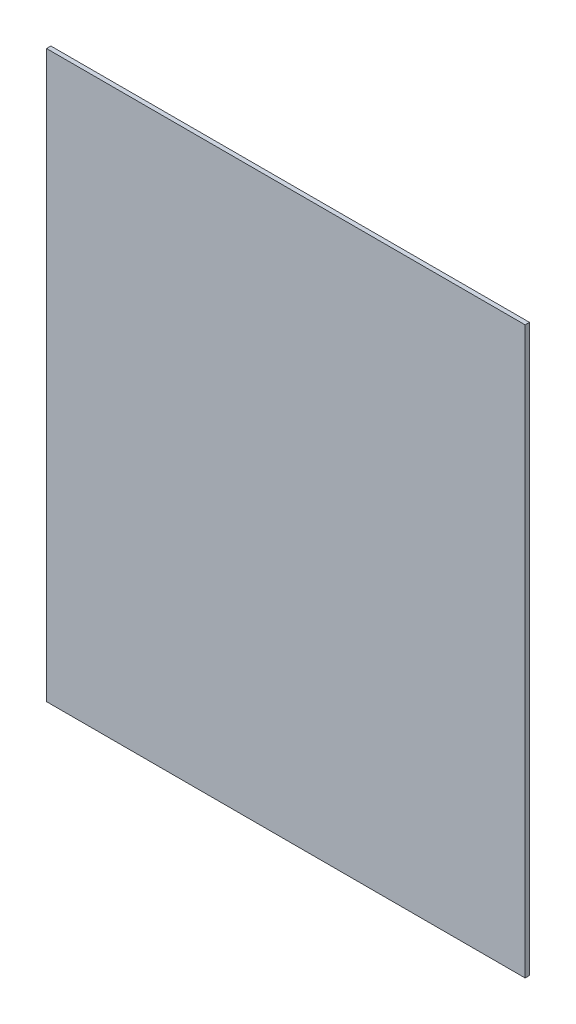
ISO-10303-21;
HEADER;
FILE_DESCRIPTION(('STEP AP214'),'2;1');
FILE_NAME('part.step','',(''),(''),'','','');
FILE_SCHEMA(('AUTOMOTIVE_DESIGN { 1 0 10303 214 1 1 1 1 }'));
ENDSEC;
DATA;
#1=APPLICATION_CONTEXT('core data for automotive mechanical design processes');
#2=APPLICATION_PROTOCOL_DEFINITION('international standard','automotive_design',2000,#1);
#3=PRODUCT_CONTEXT('',#1,'mechanical');
#4=PRODUCT('Part','Part','',(#3));
#5=PRODUCT_RELATED_PRODUCT_CATEGORY('part','',(#4));
#6=PRODUCT_DEFINITION_FORMATION('','',#4);
#7=PRODUCT_DEFINITION_CONTEXT('part definition',#1,'design');
#8=PRODUCT_DEFINITION('design','',#6,#7);
#9=PRODUCT_DEFINITION_SHAPE('','',#8);
#10=(LENGTH_UNIT() NAMED_UNIT(*) SI_UNIT(.MILLI.,.METRE.));
#11=(NAMED_UNIT(*) PLANE_ANGLE_UNIT() SI_UNIT($,.RADIAN.));
#12=(NAMED_UNIT(*) SI_UNIT($,.STERADIAN.) SOLID_ANGLE_UNIT());
#13=UNCERTAINTY_MEASURE_WITH_UNIT(LENGTH_MEASURE(1.E-05),#10,'distance_accuracy_value','');
#14=(GEOMETRIC_REPRESENTATION_CONTEXT(3) GLOBAL_UNCERTAINTY_ASSIGNED_CONTEXT((#13)) GLOBAL_UNIT_ASSIGNED_CONTEXT((#10,
#11,#12)) REPRESENTATION_CONTEXT('',''));
#15=CARTESIAN_POINT('',(0.,0.,0.));
#16=DIRECTION('',(0.,0.,1.));
#17=DIRECTION('',(1.,0.,0.));
#18=AXIS2_PLACEMENT_3D('',#15,#16,#17);
#19=CARTESIAN_POINT('',(0.,0.,3.));
#20=DIRECTION('',(1.,0.,0.));
#21=DIRECTION('',(0.,0.,-1.));
#22=AXIS2_PLACEMENT_3D('',#19,#20,#21);
#23=PLANE('',#22);
#24=DIRECTION('',(0.,-1.,0.));
#25=VECTOR('',#24,1.);
#26=CARTESIAN_POINT('',(0.,0.,0.));
#27=LINE('',#26,#25);
#28=CARTESIAN_POINT('',(0.,390.,0.));
#29=VERTEX_POINT('',#28);
#30=CARTESIAN_POINT('',(0.,0.,0.));
#31=VERTEX_POINT('',#30);
#32=EDGE_CURVE('E96',#29,#31,#27,.T.);
#33=ORIENTED_EDGE('',*,*,#32,.T.);
#34=DIRECTION('',(0.,0.,-1.));
#35=VECTOR('',#34,1.);
#36=CARTESIAN_POINT('',(0.,0.,3.));
#37=LINE('',#36,#35);
#38=CARTESIAN_POINT('',(0.,0.,3.));
#39=VERTEX_POINT('',#38);
#40=EDGE_CURVE('E11',#39,#31,#37,.T.);
#41=ORIENTED_EDGE('',*,*,#40,.F.);
#42=DIRECTION('',(0.,-1.,0.));
#43=VECTOR('',#42,1.);
#44=CARTESIAN_POINT('',(0.,0.,3.));
#45=LINE('',#44,#43);
#46=CARTESIAN_POINT('',(0.,390.,3.));
#47=VERTEX_POINT('',#46);
#48=EDGE_CURVE('E84',#47,#39,#45,.T.);
#49=ORIENTED_EDGE('',*,*,#48,.F.);
#50=DIRECTION('',(0.,0.,-1.));
#51=VECTOR('',#50,1.);
#52=CARTESIAN_POINT('',(0.,390.,3.));
#53=LINE('',#52,#51);
#54=EDGE_CURVE('E92',#47,#29,#53,.T.);
#55=ORIENTED_EDGE('',*,*,#54,.T.);
#56=EDGE_LOOP('',(#33,#41,#49,#55));
#57=FACE_BOUND('',#56,.T.);
#58=ADVANCED_FACE('F33',(#57),#23,.F.);
#59=CARTESIAN_POINT('',(0.,0.,3.));
#60=DIRECTION('',(0.,1.,0.));
#61=DIRECTION('',(0.,0.,1.));
#62=AXIS2_PLACEMENT_3D('',#59,#60,#61);
#63=PLANE('',#62);
#64=DIRECTION('',(1.,0.,0.));
#65=VECTOR('',#64,1.);
#66=CARTESIAN_POINT('',(0.,0.,0.));
#67=LINE('',#66,#65);
#68=CARTESIAN_POINT('',(330.,0.,0.));
#69=VERTEX_POINT('',#68);
#70=EDGE_CURVE('E88',#31,#69,#67,.T.);
#71=ORIENTED_EDGE('',*,*,#70,.T.);
#72=DIRECTION('',(0.,0.,-1.));
#73=VECTOR('',#72,1.);
#74=CARTESIAN_POINT('',(330.,0.,3.));
#75=LINE('',#74,#73);
#76=CARTESIAN_POINT('',(330.,0.,3.));
#77=VERTEX_POINT('',#76);
#78=EDGE_CURVE('E41',#77,#69,#75,.T.);
#79=ORIENTED_EDGE('',*,*,#78,.F.);
#80=DIRECTION('',(1.,0.,0.));
#81=VECTOR('',#80,1.);
#82=CARTESIAN_POINT('',(0.,0.,3.));
#83=LINE('',#82,#81);
#84=EDGE_CURVE('E79',#39,#77,#83,.T.);
#85=ORIENTED_EDGE('',*,*,#84,.F.);
#86=ORIENTED_EDGE('',*,*,#40,.T.);
#87=EDGE_LOOP('',(#71,#79,#85,#86));
#88=FACE_BOUND('',#87,.T.);
#89=ADVANCED_FACE('F87',(#88),#63,.F.);
#90=CARTESIAN_POINT('',(330.,0.,3.));
#91=DIRECTION('',(-1.,0.,0.));
#92=DIRECTION('',(0.,0.,1.));
#93=AXIS2_PLACEMENT_3D('',#90,#91,#92);
#94=PLANE('',#93);
#95=DIRECTION('',(0.,1.,0.));
#96=VECTOR('',#95,1.);
#97=CARTESIAN_POINT('',(330.,0.,0.));
#98=LINE('',#97,#96);
#99=CARTESIAN_POINT('',(330.,390.,0.));
#100=VERTEX_POINT('',#99);
#101=EDGE_CURVE('E66',#69,#100,#98,.T.);
#102=ORIENTED_EDGE('',*,*,#101,.T.);
#103=DIRECTION('',(0.,0.,-1.));
#104=VECTOR('',#103,1.);
#105=CARTESIAN_POINT('',(330.,390.,3.));
#106=LINE('',#105,#104);
#107=CARTESIAN_POINT('',(330.,390.,3.));
#108=VERTEX_POINT('',#107);
#109=EDGE_CURVE('E89',#108,#100,#106,.T.);
#110=ORIENTED_EDGE('',*,*,#109,.F.);
#111=DIRECTION('',(0.,1.,0.));
#112=VECTOR('',#111,1.);
#113=CARTESIAN_POINT('',(330.,0.,3.));
#114=LINE('',#113,#112);
#115=EDGE_CURVE('E82',#77,#108,#114,.T.);
#116=ORIENTED_EDGE('',*,*,#115,.F.);
#117=ORIENTED_EDGE('',*,*,#78,.T.);
#118=EDGE_LOOP('',(#102,#110,#116,#117));
#119=FACE_BOUND('',#118,.T.);
#120=ADVANCED_FACE('F90',(#119),#94,.F.);
#121=CARTESIAN_POINT('',(0.,390.,3.));
#122=DIRECTION('',(0.,-1.,0.));
#123=DIRECTION('',(0.,0.,-1.));
#124=AXIS2_PLACEMENT_3D('',#121,#122,#123);
#125=PLANE('',#124);
#126=DIRECTION('',(-1.,0.,0.));
#127=VECTOR('',#126,1.);
#128=CARTESIAN_POINT('',(0.,390.,0.));
#129=LINE('',#128,#127);
#130=EDGE_CURVE('E72',#100,#29,#129,.T.);
#131=ORIENTED_EDGE('',*,*,#130,.T.);
#132=ORIENTED_EDGE('',*,*,#54,.F.);
#133=DIRECTION('',(-1.,0.,0.));
#134=VECTOR('',#133,1.);
#135=CARTESIAN_POINT('',(0.,390.,3.));
#136=LINE('',#135,#134);
#137=EDGE_CURVE('E49',#108,#47,#136,.T.);
#138=ORIENTED_EDGE('',*,*,#137,.F.);
#139=ORIENTED_EDGE('',*,*,#109,.T.);
#140=EDGE_LOOP('',(#131,#132,#138,#139));
#141=FACE_BOUND('',#140,.T.);
#142=ADVANCED_FACE('F103',(#141),#125,.F.);
#143=CARTESIAN_POINT('',(0.,0.,3.));
#144=DIRECTION('',(0.,0.,-1.));
#145=DIRECTION('',(-1.,0.,0.));
#146=AXIS2_PLACEMENT_3D('',#143,#144,#145);
#147=PLANE('',#146);
#148=ORIENTED_EDGE('',*,*,#48,.T.);
#149=ORIENTED_EDGE('',*,*,#84,.T.);
#150=ORIENTED_EDGE('',*,*,#115,.T.);
#151=ORIENTED_EDGE('',*,*,#137,.T.);
#152=EDGE_LOOP('',(#148,#149,#150,#151));
#153=FACE_BOUND('',#152,.T.);
#154=ADVANCED_FACE('F80',(#153),#147,.F.);
#155=CARTESIAN_POINT('',(0.,0.,0.));
#156=DIRECTION('',(0.,0.,-1.));
#157=DIRECTION('',(-1.,0.,0.));
#158=AXIS2_PLACEMENT_3D('',#155,#156,#157);
#159=PLANE('',#158);
#160=ORIENTED_EDGE('',*,*,#32,.F.);
#161=ORIENTED_EDGE('',*,*,#130,.F.);
#162=ORIENTED_EDGE('',*,*,#101,.F.);
#163=ORIENTED_EDGE('',*,*,#70,.F.);
#164=EDGE_LOOP('',(#160,#161,#162,#163));
#165=FACE_BOUND('',#164,.T.);
#166=ADVANCED_FACE('F106',(#165),#159,.T.);
#167=CLOSED_SHELL('',(#58,#89,#120,#142,#154,#166));
#168=MANIFOLD_SOLID_BREP('B2',#167);
#169=ADVANCED_BREP_SHAPE_REPRESENTATION('',(#18,#168),#14);
#170=SHAPE_DEFINITION_REPRESENTATION(#9,#169);
ENDSEC;
END-ISO-10303-21;
